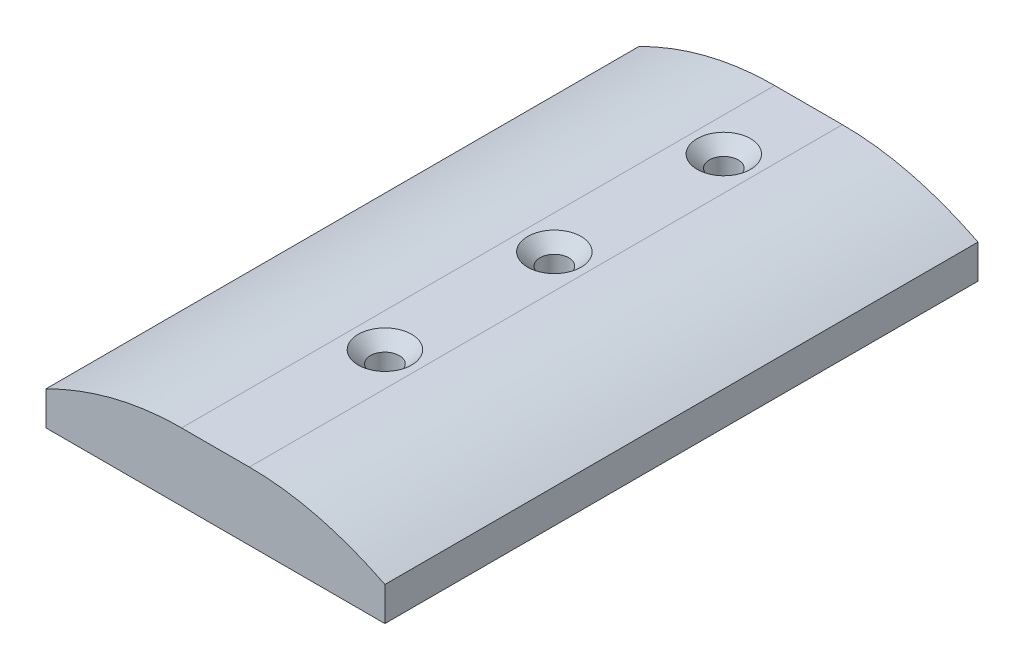
ISO-10303-21;
HEADER;
FILE_DESCRIPTION(('STEP AP214'),'2;1');
FILE_NAME('part.step','',(''),(''),'','','');
FILE_SCHEMA(('AUTOMOTIVE_DESIGN { 1 0 10303 214 1 1 1 1 }'));
ENDSEC;
DATA;
#1=APPLICATION_CONTEXT('core data for automotive mechanical design processes');
#2=APPLICATION_PROTOCOL_DEFINITION('international standard','automotive_design',2000,#1);
#3=PRODUCT_CONTEXT('',#1,'mechanical');
#4=PRODUCT('Part','Part','',(#3));
#5=PRODUCT_RELATED_PRODUCT_CATEGORY('part','',(#4));
#6=PRODUCT_DEFINITION_FORMATION('','',#4);
#7=PRODUCT_DEFINITION_CONTEXT('part definition',#1,'design');
#8=PRODUCT_DEFINITION('design','',#6,#7);
#9=PRODUCT_DEFINITION_SHAPE('','',#8);
#10=(LENGTH_UNIT() NAMED_UNIT(*) SI_UNIT(.MILLI.,.METRE.));
#11=(NAMED_UNIT(*) PLANE_ANGLE_UNIT() SI_UNIT($,.RADIAN.));
#12=(NAMED_UNIT(*) SI_UNIT($,.STERADIAN.) SOLID_ANGLE_UNIT());
#13=UNCERTAINTY_MEASURE_WITH_UNIT(LENGTH_MEASURE(1.E-05),#10,'distance_accuracy_value','');
#14=(GEOMETRIC_REPRESENTATION_CONTEXT(3) GLOBAL_UNCERTAINTY_ASSIGNED_CONTEXT((#13)) GLOBAL_UNIT_ASSIGNED_CONTEXT((#10,
#11,#12)) REPRESENTATION_CONTEXT('',''));
#15=CARTESIAN_POINT('',(0.,0.,0.));
#16=DIRECTION('',(0.,0.,1.));
#17=DIRECTION('',(1.,0.,0.));
#18=AXIS2_PLACEMENT_3D('',#15,#16,#17);
#19=CARTESIAN_POINT('',(0.,0.,0.));
#20=DIRECTION('',(0.,1.,0.));
#21=DIRECTION('',(0.,0.,1.));
#22=AXIS2_PLACEMENT_3D('',#19,#20,#21);
#23=PLANE('',#22);
#24=CARTESIAN_POINT('',(0.,0.,-25.));
#25=DIRECTION('',(0.,1.,0.));
#26=DIRECTION('',(0.,0.,1.));
#27=AXIS2_PLACEMENT_3D('',#24,#25,#26);
#28=CIRCLE('',#27,1.7);
#29=CARTESIAN_POINT('',(0.,0.,-23.3));
#30=VERTEX_POINT('',#29);
#31=EDGE_CURVE('E203',#30,#30,#28,.T.);
#32=ORIENTED_EDGE('',*,*,#31,.T.);
#33=EDGE_LOOP('',(#32));
#34=FACE_BOUND('',#33,.T.);
#35=CARTESIAN_POINT('',(0.,0.,-5.));
#36=DIRECTION('',(0.,1.,0.));
#37=DIRECTION('',(0.,0.,1.));
#38=AXIS2_PLACEMENT_3D('',#35,#36,#37);
#39=CIRCLE('',#38,1.7);
#40=CARTESIAN_POINT('',(0.,0.,-3.3));
#41=VERTEX_POINT('',#40);
#42=EDGE_CURVE('E194',#41,#41,#39,.T.);
#43=ORIENTED_EDGE('',*,*,#42,.T.);
#44=EDGE_LOOP('',(#43));
#45=FACE_BOUND('',#44,.T.);
#46=CARTESIAN_POINT('',(0.,0.,15.));
#47=DIRECTION('',(0.,1.,0.));
#48=DIRECTION('',(0.,0.,1.));
#49=AXIS2_PLACEMENT_3D('',#46,#47,#48);
#50=CIRCLE('',#49,1.7);
#51=CARTESIAN_POINT('',(0.,0.,16.7));
#52=VERTEX_POINT('',#51);
#53=EDGE_CURVE('E183',#52,#52,#50,.T.);
#54=ORIENTED_EDGE('',*,*,#53,.T.);
#55=EDGE_LOOP('',(#54));
#56=FACE_BOUND('',#55,.T.);
#57=DIRECTION('',(0.,0.,1.));
#58=VECTOR('',#57,1.);
#59=CARTESIAN_POINT('',(-20.,0.,-35.));
#60=LINE('',#59,#58);
#61=CARTESIAN_POINT('',(-20.,0.,-35.));
#62=VERTEX_POINT('',#61);
#63=CARTESIAN_POINT('',(-20.,0.,35.));
#64=VERTEX_POINT('',#63);
#65=EDGE_CURVE('E154',#62,#64,#60,.T.);
#66=ORIENTED_EDGE('',*,*,#65,.F.);
#67=DIRECTION('',(-1.,0.,0.));
#68=VECTOR('',#67,1.);
#69=CARTESIAN_POINT('',(0.,0.,-35.));
#70=LINE('',#69,#68);
#71=CARTESIAN_POINT('',(20.,0.,-35.));
#72=VERTEX_POINT('',#71);
#73=EDGE_CURVE('E162',#72,#62,#70,.T.);
#74=ORIENTED_EDGE('',*,*,#73,.F.);
#75=DIRECTION('',(0.,0.,-1.));
#76=VECTOR('',#75,1.);
#77=CARTESIAN_POINT('',(20.,0.,-35.));
#78=LINE('',#77,#76);
#79=CARTESIAN_POINT('',(20.,0.,35.));
#80=VERTEX_POINT('',#79);
#81=EDGE_CURVE('E70',#80,#72,#78,.T.);
#82=ORIENTED_EDGE('',*,*,#81,.F.);
#83=DIRECTION('',(1.,0.,0.));
#84=VECTOR('',#83,1.);
#85=CARTESIAN_POINT('',(20.,0.,35.));
#86=LINE('',#85,#84);
#87=EDGE_CURVE('E67',#64,#80,#86,.T.);
#88=ORIENTED_EDGE('',*,*,#87,.F.);
#89=EDGE_LOOP('',(#66,#74,#82,#88));
#90=FACE_BOUND('',#89,.T.);
#91=ADVANCED_FACE('F33',(#34,#45,#56,#90),#23,.F.);
#92=CARTESIAN_POINT('',(-20.,4.,-35.));
#93=DIRECTION('',(1.,0.,0.));
#94=DIRECTION('',(0.,0.,-1.));
#95=AXIS2_PLACEMENT_3D('',#92,#93,#94);
#96=PLANE('',#95);
#97=ORIENTED_EDGE('',*,*,#65,.T.);
#98=DIRECTION('',(0.,-1.,0.));
#99=VECTOR('',#98,1.);
#100=CARTESIAN_POINT('',(-20.,4.,35.));
#101=LINE('',#100,#99);
#102=CARTESIAN_POINT('',(-20.,4.,35.));
#103=VERTEX_POINT('',#102);
#104=EDGE_CURVE('E42',#103,#64,#101,.T.);
#105=ORIENTED_EDGE('',*,*,#104,.F.);
#106=DIRECTION('',(0.,0.,1.));
#107=VECTOR('',#106,1.);
#108=CARTESIAN_POINT('',(-20.,4.,-35.));
#109=LINE('',#108,#107);
#110=CARTESIAN_POINT('',(-20.,4.00000000000003,-35.));
#111=VERTEX_POINT('',#110);
#112=EDGE_CURVE('E164',#111,#103,#109,.T.);
#113=ORIENTED_EDGE('',*,*,#112,.F.);
#114=DIRECTION('',(0.,-1.,0.));
#115=VECTOR('',#114,1.);
#116=CARTESIAN_POINT('',(-20.,4.,-35.));
#117=LINE('',#116,#115);
#118=EDGE_CURVE('E11',#111,#62,#117,.T.);
#119=ORIENTED_EDGE('',*,*,#118,.T.);
#120=EDGE_LOOP('',(#97,#105,#113,#119));
#121=FACE_BOUND('',#120,.T.);
#122=ADVANCED_FACE('F35',(#121),#96,.F.);
#123=CARTESIAN_POINT('',(20.,4.,35.));
#124=DIRECTION('',(0.,0.,-1.));
#125=DIRECTION('',(-1.,0.,0.));
#126=AXIS2_PLACEMENT_3D('',#123,#124,#125);
#127=PLANE('',#126);
#128=ORIENTED_EDGE('',*,*,#87,.T.);
#129=DIRECTION('',(0.,-1.,0.));
#130=VECTOR('',#129,1.);
#131=CARTESIAN_POINT('',(20.,4.,35.));
#132=LINE('',#131,#130);
#133=CARTESIAN_POINT('',(20.,4.,35.));
#134=VERTEX_POINT('',#133);
#135=EDGE_CURVE('E114',#134,#80,#132,.T.);
#136=ORIENTED_EDGE('',*,*,#135,.F.);
#137=CARTESIAN_POINT('',(4.,8.,35.));
#138=CARTESIAN_POINT('',(9.65224997071738,8.,35.));
#139=CARTESIAN_POINT('',(14.984519900965,6.51388547983935,35.));
#140=CARTESIAN_POINT('',(20.,4.,35.));
#141=B_SPLINE_CURVE_WITH_KNOTS('',3,(#137,#138,#139,#140),.UNSPECIFIED.,.F.,.F.,(4,4),(0.,1.),.UNSPECIFIED.);
#142=CARTESIAN_POINT('',(4.,8.,35.));
#143=VERTEX_POINT('',#142);
#144=EDGE_CURVE('E102',#143,#134,#141,.T.);
#145=ORIENTED_EDGE('',*,*,#144,.F.);
#146=DIRECTION('',(1.,0.,0.));
#147=VECTOR('',#146,1.);
#148=CARTESIAN_POINT('',(0.,8.,35.));
#149=LINE('',#148,#147);
#150=CARTESIAN_POINT('',(-4.,8.,35.));
#151=VERTEX_POINT('',#150);
#152=EDGE_CURVE('E92',#151,#143,#149,.T.);
#153=ORIENTED_EDGE('',*,*,#152,.F.);
#154=CARTESIAN_POINT('',(-20.,4.,35.));
#155=CARTESIAN_POINT('',(-14.984519900965,6.51388547983934,35.));
#156=CARTESIAN_POINT('',(-9.65224997071738,8.,35.));
#157=CARTESIAN_POINT('',(-4.,8.,35.));
#158=B_SPLINE_CURVE_WITH_KNOTS('',3,(#154,#155,#156,#157),.UNSPECIFIED.,.F.,.F.,(4,4),(0.,1.),.UNSPECIFIED.);
#159=EDGE_CURVE('E111',#103,#151,#158,.T.);
#160=ORIENTED_EDGE('',*,*,#159,.F.);
#161=ORIENTED_EDGE('',*,*,#104,.T.);
#162=EDGE_LOOP('',(#128,#136,#145,#153,#160,#161));
#163=FACE_BOUND('',#162,.T.);
#164=ADVANCED_FACE('F113',(#163),#127,.F.);
#165=CARTESIAN_POINT('',(20.,4.,-35.));
#166=DIRECTION('',(-1.,0.,0.));
#167=DIRECTION('',(0.,0.,1.));
#168=AXIS2_PLACEMENT_3D('',#165,#166,#167);
#169=PLANE('',#168);
#170=ORIENTED_EDGE('',*,*,#81,.T.);
#171=DIRECTION('',(0.,-1.,0.));
#172=VECTOR('',#171,1.);
#173=CARTESIAN_POINT('',(20.,4.,-35.));
#174=LINE('',#173,#172);
#175=CARTESIAN_POINT('',(20.,4.,-35.));
#176=VERTEX_POINT('',#175);
#177=EDGE_CURVE('E50',#176,#72,#174,.T.);
#178=ORIENTED_EDGE('',*,*,#177,.F.);
#179=DIRECTION('',(0.,0.,-1.));
#180=VECTOR('',#179,1.);
#181=CARTESIAN_POINT('',(20.,4.,-35.));
#182=LINE('',#181,#180);
#183=EDGE_CURVE('E161',#134,#176,#182,.T.);
#184=ORIENTED_EDGE('',*,*,#183,.F.);
#185=ORIENTED_EDGE('',*,*,#135,.T.);
#186=EDGE_LOOP('',(#170,#178,#184,#185));
#187=FACE_BOUND('',#186,.T.);
#188=ADVANCED_FACE('F144',(#187),#169,.F.);
#189=CARTESIAN_POINT('',(0.,4.,-35.));
#190=DIRECTION('',(0.,0.,1.));
#191=DIRECTION('',(1.,0.,0.));
#192=AXIS2_PLACEMENT_3D('',#189,#190,#191);
#193=PLANE('',#192);
#194=ORIENTED_EDGE('',*,*,#73,.T.);
#195=ORIENTED_EDGE('',*,*,#118,.F.);
#196=CARTESIAN_POINT('',(-20.,4.,-35.));
#197=CARTESIAN_POINT('',(-14.984519900965,6.51388547983934,-35.));
#198=CARTESIAN_POINT('',(-9.65224997071738,8.,-35.));
#199=CARTESIAN_POINT('',(-4.,8.,-35.));
#200=B_SPLINE_CURVE_WITH_KNOTS('',3,(#196,#197,#198,#199),.UNSPECIFIED.,.F.,.F.,(4,4),(0.,1.),.UNSPECIFIED.);
#201=CARTESIAN_POINT('',(-4.,8.,-35.));
#202=VERTEX_POINT('',#201);
#203=EDGE_CURVE('E103',#111,#202,#200,.T.);
#204=ORIENTED_EDGE('',*,*,#203,.T.);
#205=DIRECTION('',(1.,0.,0.));
#206=VECTOR('',#205,1.);
#207=CARTESIAN_POINT('',(0.,8.,-35.));
#208=LINE('',#207,#206);
#209=CARTESIAN_POINT('',(4.,8.,-35.));
#210=VERTEX_POINT('',#209);
#211=EDGE_CURVE('E179',#202,#210,#208,.T.);
#212=ORIENTED_EDGE('',*,*,#211,.T.);
#213=CARTESIAN_POINT('',(4.,8.,-35.));
#214=CARTESIAN_POINT('',(9.65224997071738,8.,-35.));
#215=CARTESIAN_POINT('',(14.984519900965,6.51388547983935,-35.));
#216=CARTESIAN_POINT('',(20.,4.,-35.));
#217=B_SPLINE_CURVE_WITH_KNOTS('',3,(#213,#214,#215,#216),.UNSPECIFIED.,.F.,.F.,(4,4),(0.,1.),.UNSPECIFIED.);
#218=EDGE_CURVE('E109',#210,#176,#217,.T.);
#219=ORIENTED_EDGE('',*,*,#218,.T.);
#220=ORIENTED_EDGE('',*,*,#177,.T.);
#221=EDGE_LOOP('',(#194,#195,#204,#212,#219,#220));
#222=FACE_BOUND('',#221,.T.);
#223=ADVANCED_FACE('F141',(#222),#193,.F.);
#224=DIRECTION('',(0.,0.,-1.));
#225=VECTOR('',#224,1.);
#226=SURFACE_OF_LINEAR_EXTRUSION('',#158,#225);
#227=ORIENTED_EDGE('',*,*,#203,.F.);
#228=ORIENTED_EDGE('',*,*,#112,.T.);
#229=ORIENTED_EDGE('',*,*,#159,.T.);
#230=DIRECTION('',(0.,0.,-1.));
#231=VECTOR('',#230,1.);
#232=CARTESIAN_POINT('',(-4.,8.,35.));
#233=LINE('',#232,#231);
#234=EDGE_CURVE('E98',#151,#202,#233,.T.);
#235=ORIENTED_EDGE('',*,*,#234,.T.);
#236=EDGE_LOOP('',(#227,#228,#229,#235));
#237=FACE_BOUND('',#236,.T.);
#238=ADVANCED_FACE('F132',(#237),#226,.T.);
#239=DIRECTION('',(0.,0.,-1.));
#240=VECTOR('',#239,1.);
#241=SURFACE_OF_LINEAR_EXTRUSION('',#141,#240);
#242=ORIENTED_EDGE('',*,*,#218,.F.);
#243=DIRECTION('',(0.,0.,-1.));
#244=VECTOR('',#243,1.);
#245=CARTESIAN_POINT('',(4.,8.,35.));
#246=LINE('',#245,#244);
#247=EDGE_CURVE('E95',#143,#210,#246,.T.);
#248=ORIENTED_EDGE('',*,*,#247,.F.);
#249=ORIENTED_EDGE('',*,*,#144,.T.);
#250=ORIENTED_EDGE('',*,*,#183,.T.);
#251=EDGE_LOOP('',(#242,#248,#249,#250));
#252=FACE_BOUND('',#251,.T.);
#253=ADVANCED_FACE('F107',(#252),#241,.T.);
#254=CARTESIAN_POINT('',(0.,8.,35.));
#255=DIRECTION('',(0.,1.,0.));
#256=DIRECTION('',(0.,0.,1.));
#257=AXIS2_PLACEMENT_3D('',#254,#255,#256);
#258=PLANE('',#257);
#259=CARTESIAN_POINT('',(0.,8.,-25.));
#260=DIRECTION('',(0.,1.,0.));
#261=DIRECTION('',(0.,0.,1.));
#262=AXIS2_PLACEMENT_3D('',#259,#260,#261);
#263=CIRCLE('',#262,3.15);
#264=CARTESIAN_POINT('',(0.,8.,-21.85));
#265=VERTEX_POINT('',#264);
#266=EDGE_CURVE('E209',#265,#265,#263,.T.);
#267=ORIENTED_EDGE('',*,*,#266,.F.);
#268=EDGE_LOOP('',(#267));
#269=FACE_BOUND('',#268,.T.);
#270=CARTESIAN_POINT('',(0.,8.,-5.));
#271=DIRECTION('',(0.,1.,0.));
#272=DIRECTION('',(0.,0.,1.));
#273=AXIS2_PLACEMENT_3D('',#270,#271,#272);
#274=CIRCLE('',#273,3.15);
#275=CARTESIAN_POINT('',(0.,8.,-1.85));
#276=VERTEX_POINT('',#275);
#277=EDGE_CURVE('E200',#276,#276,#274,.T.);
#278=ORIENTED_EDGE('',*,*,#277,.F.);
#279=EDGE_LOOP('',(#278));
#280=FACE_BOUND('',#279,.T.);
#281=CARTESIAN_POINT('',(0.,8.,15.));
#282=DIRECTION('',(0.,1.,0.));
#283=DIRECTION('',(0.,0.,1.));
#284=AXIS2_PLACEMENT_3D('',#281,#282,#283);
#285=CIRCLE('',#284,3.15);
#286=CARTESIAN_POINT('',(0.,8.,18.15));
#287=VERTEX_POINT('',#286);
#288=EDGE_CURVE('E189',#287,#287,#285,.T.);
#289=ORIENTED_EDGE('',*,*,#288,.F.);
#290=EDGE_LOOP('',(#289));
#291=FACE_BOUND('',#290,.T.);
#292=ORIENTED_EDGE('',*,*,#211,.F.);
#293=ORIENTED_EDGE('',*,*,#234,.F.);
#294=ORIENTED_EDGE('',*,*,#152,.T.);
#295=ORIENTED_EDGE('',*,*,#247,.T.);
#296=EDGE_LOOP('',(#292,#293,#294,#295));
#297=FACE_BOUND('',#296,.T.);
#298=ADVANCED_FACE('F94',(#269,#280,#291,#297),#258,.T.);
#299=CARTESIAN_POINT('',(0.,8.,15.));
#300=DIRECTION('',(0.,1.,0.));
#301=DIRECTION('',(0.,0.,1.));
#302=AXIS2_PLACEMENT_3D('',#299,#300,#301);
#303=CYLINDRICAL_SURFACE('',#302,1.7);
#304=ORIENTED_EDGE('',*,*,#53,.F.);
#305=EDGE_LOOP('',(#304));
#306=FACE_BOUND('',#305,.T.);
#307=CARTESIAN_POINT('',(0.,6.55,15.));
#308=DIRECTION('',(0.,1.,0.));
#309=DIRECTION('',(0.,0.,1.));
#310=AXIS2_PLACEMENT_3D('',#307,#308,#309);
#311=CIRCLE('',#310,1.7);
#312=CARTESIAN_POINT('',(0.,6.55,16.7));
#313=VERTEX_POINT('',#312);
#314=EDGE_CURVE('E185',#313,#313,#311,.T.);
#315=ORIENTED_EDGE('',*,*,#314,.T.);
#316=EDGE_LOOP('',(#315));
#317=FACE_BOUND('',#316,.T.);
#318=ADVANCED_FACE('F136',(#306,#317),#303,.F.);
#319=CARTESIAN_POINT('',(0.,8.,15.));
#320=DIRECTION('',(0.,1.,0.));
#321=DIRECTION('',(0.,0.,1.));
#322=AXIS2_PLACEMENT_3D('',#319,#320,#321);
#323=CONICAL_SURFACE('',#322,3.15,0.785398163397448);
#324=ORIENTED_EDGE('',*,*,#314,.F.);
#325=EDGE_LOOP('',(#324));
#326=FACE_BOUND('',#325,.T.);
#327=ORIENTED_EDGE('',*,*,#288,.T.);
#328=EDGE_LOOP('',(#327));
#329=FACE_BOUND('',#328,.T.);
#330=ADVANCED_FACE('F219',(#326,#329),#323,.F.);
#331=CARTESIAN_POINT('',(0.,8.,-5.));
#332=DIRECTION('',(0.,1.,0.));
#333=DIRECTION('',(0.,0.,1.));
#334=AXIS2_PLACEMENT_3D('',#331,#332,#333);
#335=CYLINDRICAL_SURFACE('',#334,1.7);
#336=ORIENTED_EDGE('',*,*,#42,.F.);
#337=EDGE_LOOP('',(#336));
#338=FACE_BOUND('',#337,.T.);
#339=CARTESIAN_POINT('',(0.,6.55,-5.));
#340=DIRECTION('',(0.,1.,0.));
#341=DIRECTION('',(0.,0.,1.));
#342=AXIS2_PLACEMENT_3D('',#339,#340,#341);
#343=CIRCLE('',#342,1.7);
#344=CARTESIAN_POINT('',(0.,6.55,-3.3));
#345=VERTEX_POINT('',#344);
#346=EDGE_CURVE('E197',#345,#345,#343,.T.);
#347=ORIENTED_EDGE('',*,*,#346,.T.);
#348=EDGE_LOOP('',(#347));
#349=FACE_BOUND('',#348,.T.);
#350=ADVANCED_FACE('F221',(#338,#349),#335,.F.);
#351=CARTESIAN_POINT('',(0.,8.,-5.));
#352=DIRECTION('',(0.,1.,0.));
#353=DIRECTION('',(0.,0.,1.));
#354=AXIS2_PLACEMENT_3D('',#351,#352,#353);
#355=CONICAL_SURFACE('',#354,3.15,0.785398163397448);
#356=ORIENTED_EDGE('',*,*,#346,.F.);
#357=EDGE_LOOP('',(#356));
#358=FACE_BOUND('',#357,.T.);
#359=ORIENTED_EDGE('',*,*,#277,.T.);
#360=EDGE_LOOP('',(#359));
#361=FACE_BOUND('',#360,.T.);
#362=ADVANCED_FACE('F228',(#358,#361),#355,.F.);
#363=CARTESIAN_POINT('',(0.,8.,-25.));
#364=DIRECTION('',(0.,1.,0.));
#365=DIRECTION('',(0.,0.,1.));
#366=AXIS2_PLACEMENT_3D('',#363,#364,#365);
#367=CYLINDRICAL_SURFACE('',#366,1.7);
#368=ORIENTED_EDGE('',*,*,#31,.F.);
#369=EDGE_LOOP('',(#368));
#370=FACE_BOUND('',#369,.T.);
#371=CARTESIAN_POINT('',(0.,6.55,-25.));
#372=DIRECTION('',(0.,1.,0.));
#373=DIRECTION('',(0.,0.,1.));
#374=AXIS2_PLACEMENT_3D('',#371,#372,#373);
#375=CIRCLE('',#374,1.7);
#376=CARTESIAN_POINT('',(0.,6.55,-23.3));
#377=VERTEX_POINT('',#376);
#378=EDGE_CURVE('E206',#377,#377,#375,.T.);
#379=ORIENTED_EDGE('',*,*,#378,.T.);
#380=EDGE_LOOP('',(#379));
#381=FACE_BOUND('',#380,.T.);
#382=ADVANCED_FACE('F236',(#370,#381),#367,.F.);
#383=CARTESIAN_POINT('',(0.,8.,-25.));
#384=DIRECTION('',(0.,1.,0.));
#385=DIRECTION('',(0.,0.,1.));
#386=AXIS2_PLACEMENT_3D('',#383,#384,#385);
#387=CONICAL_SURFACE('',#386,3.15,0.785398163397448);
#388=ORIENTED_EDGE('',*,*,#378,.F.);
#389=EDGE_LOOP('',(#388));
#390=FACE_BOUND('',#389,.T.);
#391=ORIENTED_EDGE('',*,*,#266,.T.);
#392=EDGE_LOOP('',(#391));
#393=FACE_BOUND('',#392,.T.);
#394=ADVANCED_FACE('F213',(#390,#393),#387,.F.);
#395=CLOSED_SHELL('',(#91,#122,#164,#188,#223,#238,#253,#298,#318,#330,#350,#362,#382,#394));
#396=MANIFOLD_SOLID_BREP('B2',#395);
#397=ADVANCED_BREP_SHAPE_REPRESENTATION('',(#18,#396),#14);
#398=SHAPE_DEFINITION_REPRESENTATION(#9,#397);
ENDSEC;
END-ISO-10303-21;
